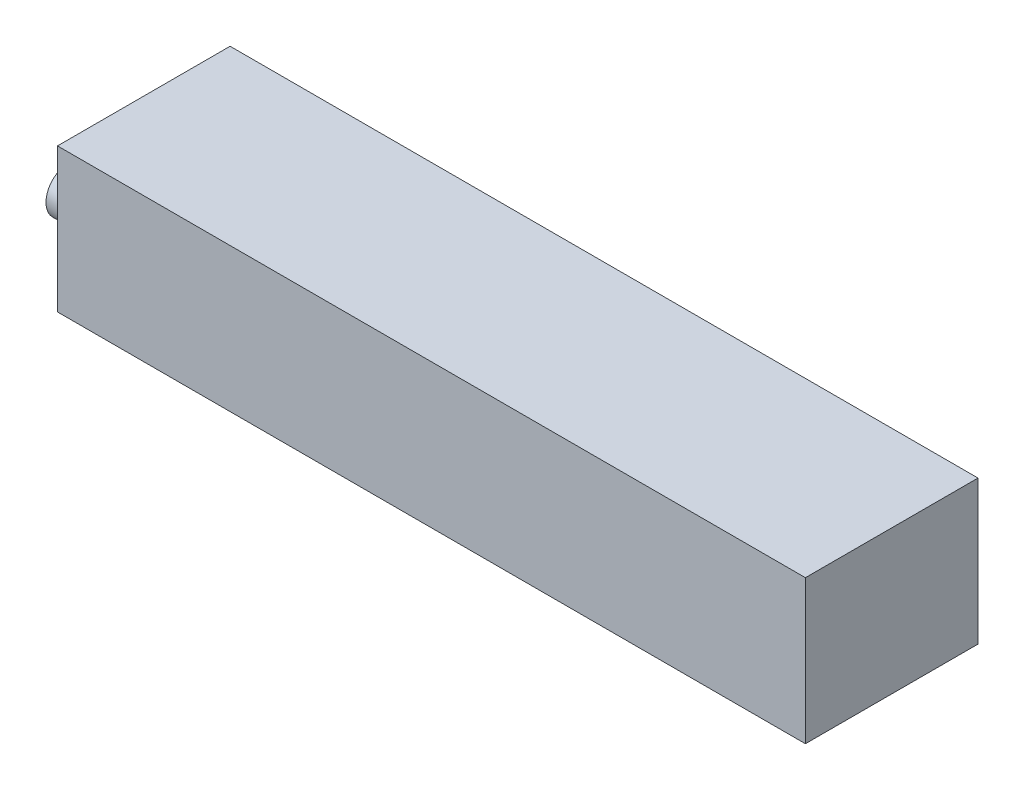
ISO-10303-21;
HEADER;
FILE_DESCRIPTION(('STEP AP214'),'2;1');
FILE_NAME('part.step','',(''),(''),'','','');
FILE_SCHEMA(('AUTOMOTIVE_DESIGN { 1 0 10303 214 1 1 1 1 }'));
ENDSEC;
DATA;
#1=APPLICATION_CONTEXT('core data for automotive mechanical design processes');
#2=APPLICATION_PROTOCOL_DEFINITION('international standard','automotive_design',2000,#1);
#3=PRODUCT_CONTEXT('',#1,'mechanical');
#4=PRODUCT('Part','Part','',(#3));
#5=PRODUCT_RELATED_PRODUCT_CATEGORY('part','',(#4));
#6=PRODUCT_DEFINITION_FORMATION('','',#4);
#7=PRODUCT_DEFINITION_CONTEXT('part definition',#1,'design');
#8=PRODUCT_DEFINITION('design','',#6,#7);
#9=PRODUCT_DEFINITION_SHAPE('','',#8);
#10=(LENGTH_UNIT() NAMED_UNIT(*) SI_UNIT(.MILLI.,.METRE.));
#11=(NAMED_UNIT(*) PLANE_ANGLE_UNIT() SI_UNIT($,.RADIAN.));
#12=(NAMED_UNIT(*) SI_UNIT($,.STERADIAN.) SOLID_ANGLE_UNIT());
#13=UNCERTAINTY_MEASURE_WITH_UNIT(LENGTH_MEASURE(1.E-05),#10,'distance_accuracy_value','');
#14=(GEOMETRIC_REPRESENTATION_CONTEXT(3) GLOBAL_UNCERTAINTY_ASSIGNED_CONTEXT((#13)) GLOBAL_UNIT_ASSIGNED_CONTEXT((#10,
#11,#12)) REPRESENTATION_CONTEXT('',''));
#15=CARTESIAN_POINT('',(0.,0.,0.));
#16=DIRECTION('',(0.,0.,1.));
#17=DIRECTION('',(1.,0.,0.));
#18=AXIS2_PLACEMENT_3D('',#15,#16,#17);
#19=CARTESIAN_POINT('',(65.,25.,-15.));
#20=DIRECTION('',(-1.,0.,0.));
#21=DIRECTION('',(0.,0.,1.));
#22=AXIS2_PLACEMENT_3D('',#19,#20,#21);
#23=PLANE('',#22);
#24=DIRECTION('',(0.,0.,-1.));
#25=VECTOR('',#24,1.);
#26=CARTESIAN_POINT('',(65.,0.,-15.));
#27=LINE('',#26,#25);
#28=CARTESIAN_POINT('',(65.,0.,15.));
#29=VERTEX_POINT('',#28);
#30=CARTESIAN_POINT('',(65.,0.,-15.));
#31=VERTEX_POINT('',#30);
#32=EDGE_CURVE('E102',#29,#31,#27,.T.);
#33=ORIENTED_EDGE('',*,*,#32,.T.);
#34=DIRECTION('',(0.,-1.,0.));
#35=VECTOR('',#34,1.);
#36=CARTESIAN_POINT('',(65.,25.,-15.));
#37=LINE('',#36,#35);
#38=CARTESIAN_POINT('',(65.,25.,-15.));
#39=VERTEX_POINT('',#38);
#40=EDGE_CURVE('E93',#39,#31,#37,.T.);
#41=ORIENTED_EDGE('',*,*,#40,.F.);
#42=DIRECTION('',(0.,0.,-1.));
#43=VECTOR('',#42,1.);
#44=CARTESIAN_POINT('',(65.,25.,-15.));
#45=LINE('',#44,#43);
#46=CARTESIAN_POINT('',(65.,25.,15.));
#47=VERTEX_POINT('',#46);
#48=EDGE_CURVE('E87',#47,#39,#45,.T.);
#49=ORIENTED_EDGE('',*,*,#48,.F.);
#50=DIRECTION('',(0.,-1.,0.));
#51=VECTOR('',#50,1.);
#52=CARTESIAN_POINT('',(65.,25.,15.));
#53=LINE('',#52,#51);
#54=EDGE_CURVE('E98',#47,#29,#53,.T.);
#55=ORIENTED_EDGE('',*,*,#54,.T.);
#56=EDGE_LOOP('',(#33,#41,#49,#55));
#57=FACE_BOUND('',#56,.T.);
#58=ADVANCED_FACE('F35',(#57),#23,.F.);
#59=CARTESIAN_POINT('',(-65.,25.,-15.));
#60=DIRECTION('',(0.,0.,1.));
#61=DIRECTION('',(1.,0.,0.));
#62=AXIS2_PLACEMENT_3D('',#59,#60,#61);
#63=PLANE('',#62);
#64=DIRECTION('',(-1.,0.,0.));
#65=VECTOR('',#64,1.);
#66=CARTESIAN_POINT('',(-65.,0.,-15.));
#67=LINE('',#66,#65);
#68=CARTESIAN_POINT('',(-65.,0.,-15.));
#69=VERTEX_POINT('',#68);
#70=EDGE_CURVE('E92',#31,#69,#67,.T.);
#71=ORIENTED_EDGE('',*,*,#70,.T.);
#72=DIRECTION('',(0.,-1.,0.));
#73=VECTOR('',#72,1.);
#74=CARTESIAN_POINT('',(-65.,25.,-15.));
#75=LINE('',#74,#73);
#76=CARTESIAN_POINT('',(-65.,25.,-15.));
#77=VERTEX_POINT('',#76);
#78=EDGE_CURVE('E90',#77,#69,#75,.T.);
#79=ORIENTED_EDGE('',*,*,#78,.F.);
#80=DIRECTION('',(-1.,0.,0.));
#81=VECTOR('',#80,1.);
#82=CARTESIAN_POINT('',(-65.,25.,-15.));
#83=LINE('',#82,#81);
#84=EDGE_CURVE('E82',#39,#77,#83,.T.);
#85=ORIENTED_EDGE('',*,*,#84,.F.);
#86=ORIENTED_EDGE('',*,*,#40,.T.);
#87=EDGE_LOOP('',(#71,#79,#85,#86));
#88=FACE_BOUND('',#87,.T.);
#89=ADVANCED_FACE('F91',(#88),#63,.F.);
#90=CARTESIAN_POINT('',(-65.,25.,-15.));
#91=DIRECTION('',(1.,0.,0.));
#92=DIRECTION('',(0.,0.,-1.));
#93=AXIS2_PLACEMENT_3D('',#90,#91,#92);
#94=PLANE('',#93);
#95=CARTESIAN_POINT('',(-65.,12.5,8.));
#96=DIRECTION('',(1.,0.,0.));
#97=DIRECTION('',(0.,0.,-1.));
#98=AXIS2_PLACEMENT_3D('',#95,#96,#97);
#99=CIRCLE('',#98,4.);
#100=CARTESIAN_POINT('',(-65.,12.5,4.));
#101=VERTEX_POINT('',#100);
#102=EDGE_CURVE('E11',#101,#101,#99,.F.);
#103=ORIENTED_EDGE('',*,*,#102,.F.);
#104=EDGE_LOOP('',(#103));
#105=FACE_BOUND('',#104,.T.);
#106=CARTESIAN_POINT('',(-65.,12.5,-8.));
#107=DIRECTION('',(1.,0.,0.));
#108=DIRECTION('',(0.,0.,-1.));
#109=AXIS2_PLACEMENT_3D('',#106,#107,#108);
#110=CIRCLE('',#109,4.);
#111=CARTESIAN_POINT('',(-65.,12.5,-12.));
#112=VERTEX_POINT('',#111);
#113=EDGE_CURVE('E43',#112,#112,#110,.F.);
#114=ORIENTED_EDGE('',*,*,#113,.F.);
#115=EDGE_LOOP('',(#114));
#116=FACE_BOUND('',#115,.T.);
#117=DIRECTION('',(0.,0.,1.));
#118=VECTOR('',#117,1.);
#119=CARTESIAN_POINT('',(-65.,0.,-15.));
#120=LINE('',#119,#118);
#121=CARTESIAN_POINT('',(-65.,0.,15.));
#122=VERTEX_POINT('',#121);
#123=EDGE_CURVE('E68',#69,#122,#120,.T.);
#124=ORIENTED_EDGE('',*,*,#123,.T.);
#125=DIRECTION('',(0.,-1.,0.));
#126=VECTOR('',#125,1.);
#127=CARTESIAN_POINT('',(-65.,25.,15.));
#128=LINE('',#127,#126);
#129=CARTESIAN_POINT('',(-65.,25.,15.));
#130=VERTEX_POINT('',#129);
#131=EDGE_CURVE('E94',#130,#122,#128,.T.);
#132=ORIENTED_EDGE('',*,*,#131,.F.);
#133=DIRECTION('',(0.,0.,1.));
#134=VECTOR('',#133,1.);
#135=CARTESIAN_POINT('',(-65.,25.,-15.));
#136=LINE('',#135,#134);
#137=EDGE_CURVE('E85',#77,#130,#136,.T.);
#138=ORIENTED_EDGE('',*,*,#137,.F.);
#139=ORIENTED_EDGE('',*,*,#78,.T.);
#140=EDGE_LOOP('',(#124,#132,#138,#139));
#141=FACE_BOUND('',#140,.T.);
#142=ADVANCED_FACE('F96',(#105,#116,#141),#94,.F.);
#143=CARTESIAN_POINT('',(-65.,25.,15.));
#144=DIRECTION('',(0.,0.,-1.));
#145=DIRECTION('',(-1.,0.,0.));
#146=AXIS2_PLACEMENT_3D('',#143,#144,#145);
#147=PLANE('',#146);
#148=DIRECTION('',(1.,0.,0.));
#149=VECTOR('',#148,1.);
#150=CARTESIAN_POINT('',(-65.,0.,15.));
#151=LINE('',#150,#149);
#152=EDGE_CURVE('E74',#122,#29,#151,.T.);
#153=ORIENTED_EDGE('',*,*,#152,.T.);
#154=ORIENTED_EDGE('',*,*,#54,.F.);
#155=DIRECTION('',(1.,0.,0.));
#156=VECTOR('',#155,1.);
#157=CARTESIAN_POINT('',(-65.,25.,15.));
#158=LINE('',#157,#156);
#159=EDGE_CURVE('E51',#130,#47,#158,.T.);
#160=ORIENTED_EDGE('',*,*,#159,.F.);
#161=ORIENTED_EDGE('',*,*,#131,.T.);
#162=EDGE_LOOP('',(#153,#154,#160,#161));
#163=FACE_BOUND('',#162,.T.);
#164=ADVANCED_FACE('F117',(#163),#147,.F.);
#165=CARTESIAN_POINT('',(0.,25.,0.));
#166=DIRECTION('',(0.,1.,0.));
#167=DIRECTION('',(0.,0.,1.));
#168=AXIS2_PLACEMENT_3D('',#165,#166,#167);
#169=PLANE('',#168);
#170=ORIENTED_EDGE('',*,*,#48,.T.);
#171=ORIENTED_EDGE('',*,*,#84,.T.);
#172=ORIENTED_EDGE('',*,*,#137,.T.);
#173=ORIENTED_EDGE('',*,*,#159,.T.);
#174=EDGE_LOOP('',(#170,#171,#172,#173));
#175=FACE_BOUND('',#174,.T.);
#176=ADVANCED_FACE('F83',(#175),#169,.T.);
#177=CARTESIAN_POINT('',(0.,0.,0.));
#178=DIRECTION('',(0.,1.,0.));
#179=DIRECTION('',(0.,0.,1.));
#180=AXIS2_PLACEMENT_3D('',#177,#178,#179);
#181=PLANE('',#180);
#182=ORIENTED_EDGE('',*,*,#32,.F.);
#183=ORIENTED_EDGE('',*,*,#152,.F.);
#184=ORIENTED_EDGE('',*,*,#123,.F.);
#185=ORIENTED_EDGE('',*,*,#70,.F.);
#186=EDGE_LOOP('',(#182,#183,#184,#185));
#187=FACE_BOUND('',#186,.T.);
#188=ADVANCED_FACE('F132',(#187),#181,.F.);
#189=CARTESIAN_POINT('',(-70.,12.5,-8.));
#190=DIRECTION('',(1.,0.,0.));
#191=DIRECTION('',(0.,0.,-1.));
#192=AXIS2_PLACEMENT_3D('',#189,#190,#191);
#193=CYLINDRICAL_SURFACE('',#192,4.);
#194=CARTESIAN_POINT('',(-70.,12.5,-8.));
#195=DIRECTION('',(-1.,0.,0.));
#196=DIRECTION('',(0.,0.,1.));
#197=AXIS2_PLACEMENT_3D('',#194,#195,#196);
#198=CIRCLE('',#197,4.);
#199=CARTESIAN_POINT('',(-70.,12.5,-4.));
#200=VERTEX_POINT('',#199);
#201=EDGE_CURVE('E105',#200,#200,#198,.T.);
#202=ORIENTED_EDGE('',*,*,#201,.F.);
#203=EDGE_LOOP('',(#202));
#204=FACE_BOUND('',#203,.T.);
#205=ORIENTED_EDGE('',*,*,#113,.T.);
#206=EDGE_LOOP('',(#205));
#207=FACE_BOUND('',#206,.T.);
#208=ADVANCED_FACE('F114',(#204,#207),#193,.T.);
#209=CARTESIAN_POINT('',(-70.,12.5,-8.));
#210=DIRECTION('',(-1.,0.,0.));
#211=DIRECTION('',(0.,0.,1.));
#212=AXIS2_PLACEMENT_3D('',#209,#210,#211);
#213=PLANE('',#212);
#214=ORIENTED_EDGE('',*,*,#201,.T.);
#215=EDGE_LOOP('',(#214));
#216=FACE_BOUND('',#215,.T.);
#217=ADVANCED_FACE('F139',(#216),#213,.T.);
#218=CARTESIAN_POINT('',(-70.,12.5,8.));
#219=DIRECTION('',(1.,0.,0.));
#220=DIRECTION('',(0.,0.,-1.));
#221=AXIS2_PLACEMENT_3D('',#218,#219,#220);
#222=CYLINDRICAL_SURFACE('',#221,4.);
#223=CARTESIAN_POINT('',(-70.,12.5,8.));
#224=DIRECTION('',(-1.,0.,0.));
#225=DIRECTION('',(0.,0.,1.));
#226=AXIS2_PLACEMENT_3D('',#223,#224,#225);
#227=CIRCLE('',#226,4.);
#228=CARTESIAN_POINT('',(-70.,12.5,12.));
#229=VERTEX_POINT('',#228);
#230=EDGE_CURVE('E158',#229,#229,#227,.T.);
#231=ORIENTED_EDGE('',*,*,#230,.F.);
#232=EDGE_LOOP('',(#231));
#233=FACE_BOUND('',#232,.T.);
#234=ORIENTED_EDGE('',*,*,#102,.T.);
#235=EDGE_LOOP('',(#234));
#236=FACE_BOUND('',#235,.T.);
#237=ADVANCED_FACE('F146',(#233,#236),#222,.T.);
#238=CARTESIAN_POINT('',(-70.,12.5,8.));
#239=DIRECTION('',(-1.,0.,0.));
#240=DIRECTION('',(0.,0.,1.));
#241=AXIS2_PLACEMENT_3D('',#238,#239,#240);
#242=PLANE('',#241);
#243=ORIENTED_EDGE('',*,*,#230,.T.);
#244=EDGE_LOOP('',(#243));
#245=FACE_BOUND('',#244,.T.);
#246=ADVANCED_FACE('F150',(#245),#242,.T.);
#247=CLOSED_SHELL('',(#58,#89,#142,#164,#176,#188,#208,#217,#237,#246));
#248=MANIFOLD_SOLID_BREP('B2',#247);
#249=ADVANCED_BREP_SHAPE_REPRESENTATION('',(#18,#248),#14);
#250=SHAPE_DEFINITION_REPRESENTATION(#9,#249);
ENDSEC;
END-ISO-10303-21;
